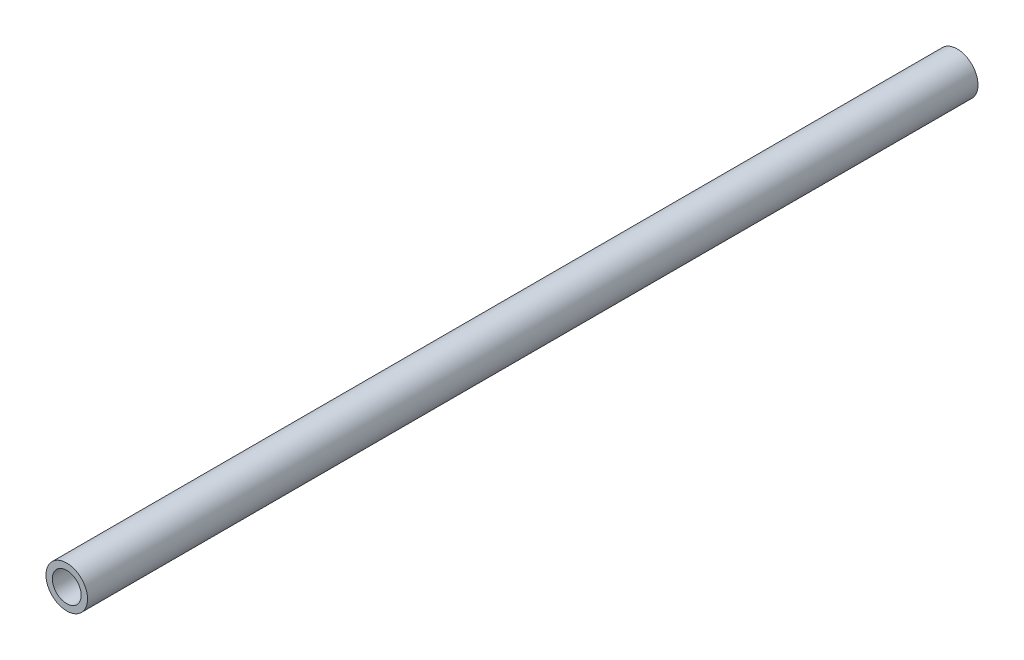
ISO-10303-21;
HEADER;
FILE_DESCRIPTION(('STEP AP214'),'2;1');
FILE_NAME('part.step','',(''),(''),'','','');
FILE_SCHEMA(('AUTOMOTIVE_DESIGN { 1 0 10303 214 1 1 1 1 }'));
ENDSEC;
DATA;
#1=APPLICATION_CONTEXT('core data for automotive mechanical design processes');
#2=APPLICATION_PROTOCOL_DEFINITION('international standard','automotive_design',2000,#1);
#3=PRODUCT_CONTEXT('',#1,'mechanical');
#4=PRODUCT('Part','Part','',(#3));
#5=PRODUCT_RELATED_PRODUCT_CATEGORY('part','',(#4));
#6=PRODUCT_DEFINITION_FORMATION('','',#4);
#7=PRODUCT_DEFINITION_CONTEXT('part definition',#1,'design');
#8=PRODUCT_DEFINITION('design','',#6,#7);
#9=PRODUCT_DEFINITION_SHAPE('','',#8);
#10=(LENGTH_UNIT() NAMED_UNIT(*) SI_UNIT(.MILLI.,.METRE.));
#11=(NAMED_UNIT(*) PLANE_ANGLE_UNIT() SI_UNIT($,.RADIAN.));
#12=(NAMED_UNIT(*) SI_UNIT($,.STERADIAN.) SOLID_ANGLE_UNIT());
#13=UNCERTAINTY_MEASURE_WITH_UNIT(LENGTH_MEASURE(1.E-05),#10,'distance_accuracy_value','');
#14=(GEOMETRIC_REPRESENTATION_CONTEXT(3) GLOBAL_UNCERTAINTY_ASSIGNED_CONTEXT((#13)) GLOBAL_UNIT_ASSIGNED_CONTEXT((#10,
#11,#12)) REPRESENTATION_CONTEXT('',''));
#15=CARTESIAN_POINT('',(0.,0.,0.));
#16=DIRECTION('',(0.,0.,1.));
#17=DIRECTION('',(1.,0.,0.));
#18=AXIS2_PLACEMENT_3D('',#15,#16,#17);
#19=CARTESIAN_POINT('',(0.,0.,97.917));
#20=DIRECTION('',(0.,0.,1.));
#21=DIRECTION('',(1.,0.,0.));
#22=AXIS2_PLACEMENT_3D('',#19,#20,#21);
#23=PLANE('',#22);
#24=CARTESIAN_POINT('',(0.,0.,97.917));
#25=DIRECTION('',(0.,0.,1.));
#26=DIRECTION('',(1.,0.,0.));
#27=AXIS2_PLACEMENT_3D('',#24,#25,#26);
#28=CIRCLE('',#27,4.572);
#29=CARTESIAN_POINT('',(4.572,0.,97.917));
#30=VERTEX_POINT('',#29);
#31=EDGE_CURVE('E10',#30,#30,#28,.T.);
#32=ORIENTED_EDGE('',*,*,#31,.T.);
#33=EDGE_LOOP('',(#32));
#34=FACE_BOUND('',#33,.T.);
#35=CARTESIAN_POINT('',(0.,0.,97.917));
#36=DIRECTION('',(0.,0.,1.));
#37=DIRECTION('',(1.,0.,0.));
#38=AXIS2_PLACEMENT_3D('',#35,#36,#37);
#39=CIRCLE('',#38,3.175);
#40=CARTESIAN_POINT('',(3.175,0.,97.917));
#41=VERTEX_POINT('',#40);
#42=EDGE_CURVE('E45',#41,#41,#39,.T.);
#43=ORIENTED_EDGE('',*,*,#42,.F.);
#44=EDGE_LOOP('',(#43));
#45=FACE_BOUND('',#44,.T.);
#46=ADVANCED_FACE('F37',(#34,#45),#23,.T.);
#47=CARTESIAN_POINT('',(0.,0.,97.917));
#48=DIRECTION('',(0.,0.,-1.));
#49=DIRECTION('',(-1.,0.,0.));
#50=AXIS2_PLACEMENT_3D('',#47,#48,#49);
#51=CYLINDRICAL_SURFACE('',#50,4.572);
#52=ORIENTED_EDGE('',*,*,#31,.F.);
#53=EDGE_LOOP('',(#52));
#54=FACE_BOUND('',#53,.T.);
#55=CARTESIAN_POINT('',(0.,0.,-97.917));
#56=DIRECTION('',(0.,0.,1.));
#57=DIRECTION('',(1.,0.,0.));
#58=AXIS2_PLACEMENT_3D('',#55,#56,#57);
#59=CIRCLE('',#58,4.572);
#60=CARTESIAN_POINT('',(4.572,0.,-97.917));
#61=VERTEX_POINT('',#60);
#62=EDGE_CURVE('E50',#61,#61,#59,.T.);
#63=ORIENTED_EDGE('',*,*,#62,.T.);
#64=EDGE_LOOP('',(#63));
#65=FACE_BOUND('',#64,.T.);
#66=ADVANCED_FACE('F39',(#54,#65),#51,.T.);
#67=CARTESIAN_POINT('',(0.,0.,97.917));
#68=DIRECTION('',(0.,0.,-1.));
#69=DIRECTION('',(-1.,0.,0.));
#70=AXIS2_PLACEMENT_3D('',#67,#68,#69);
#71=CYLINDRICAL_SURFACE('',#70,3.175);
#72=ORIENTED_EDGE('',*,*,#42,.T.);
#73=EDGE_LOOP('',(#72));
#74=FACE_BOUND('',#73,.T.);
#75=CARTESIAN_POINT('',(0.,0.,-97.917));
#76=DIRECTION('',(0.,0.,1.));
#77=DIRECTION('',(1.,0.,0.));
#78=AXIS2_PLACEMENT_3D('',#75,#76,#77);
#79=CIRCLE('',#78,3.175);
#80=CARTESIAN_POINT('',(3.175,0.,-97.917));
#81=VERTEX_POINT('',#80);
#82=EDGE_CURVE('E55',#81,#81,#79,.T.);
#83=ORIENTED_EDGE('',*,*,#82,.F.);
#84=EDGE_LOOP('',(#83));
#85=FACE_BOUND('',#84,.T.);
#86=ADVANCED_FACE('F65',(#74,#85),#71,.F.);
#87=CARTESIAN_POINT('',(0.,0.,-97.917));
#88=DIRECTION('',(0.,0.,1.));
#89=DIRECTION('',(1.,0.,0.));
#90=AXIS2_PLACEMENT_3D('',#87,#88,#89);
#91=PLANE('',#90);
#92=ORIENTED_EDGE('',*,*,#82,.T.);
#93=EDGE_LOOP('',(#92));
#94=FACE_BOUND('',#93,.T.);
#95=ORIENTED_EDGE('',*,*,#62,.F.);
#96=EDGE_LOOP('',(#95));
#97=FACE_BOUND('',#96,.T.);
#98=ADVANCED_FACE('F62',(#94,#97),#91,.F.);
#99=CLOSED_SHELL('',(#46,#66,#86,#98));
#100=MANIFOLD_SOLID_BREP('B2',#99);
#101=ADVANCED_BREP_SHAPE_REPRESENTATION('',(#18,#100),#14);
#102=SHAPE_DEFINITION_REPRESENTATION(#9,#101);
ENDSEC;
END-ISO-10303-21;
